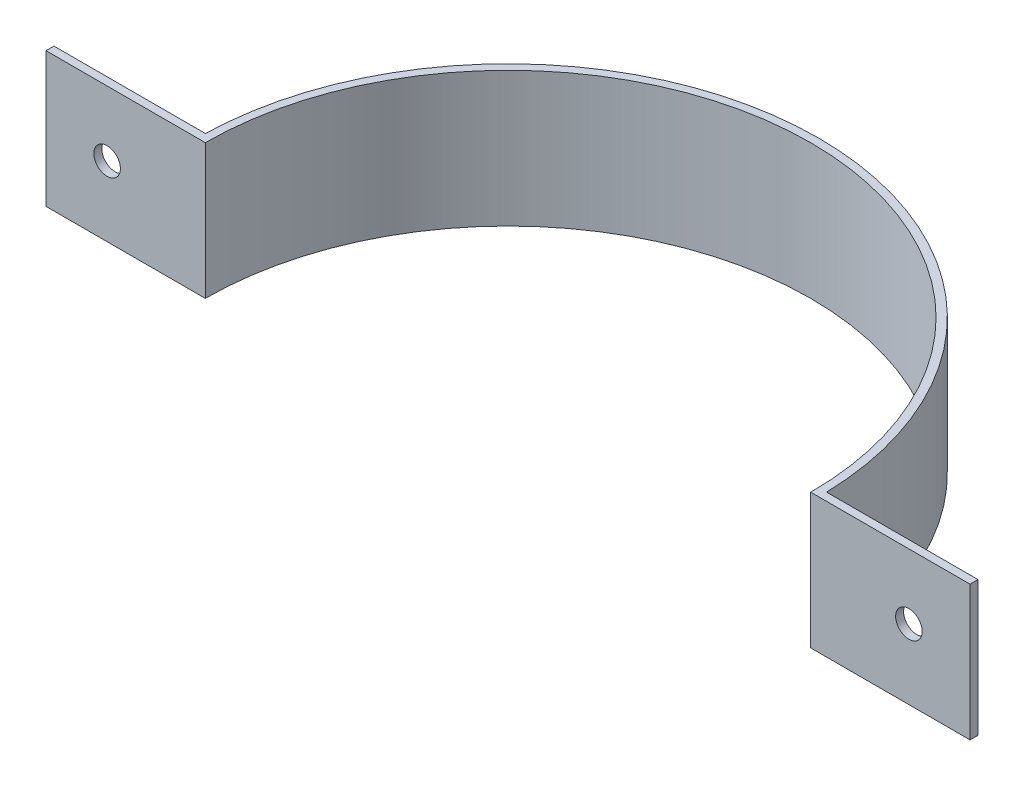
ISO-10303-21;
HEADER;
FILE_DESCRIPTION(('STEP AP214'),'2;1');
FILE_NAME('part.step','',(''),(''),'','','');
FILE_SCHEMA(('AUTOMOTIVE_DESIGN { 1 0 10303 214 1 1 1 1 }'));
ENDSEC;
DATA;
#1=APPLICATION_CONTEXT('core data for automotive mechanical design processes');
#2=APPLICATION_PROTOCOL_DEFINITION('international standard','automotive_design',2000,#1);
#3=PRODUCT_CONTEXT('',#1,'mechanical');
#4=PRODUCT('Part','Part','',(#3));
#5=PRODUCT_RELATED_PRODUCT_CATEGORY('part','',(#4));
#6=PRODUCT_DEFINITION_FORMATION('','',#4);
#7=PRODUCT_DEFINITION_CONTEXT('part definition',#1,'design');
#8=PRODUCT_DEFINITION('design','',#6,#7);
#9=PRODUCT_DEFINITION_SHAPE('','',#8);
#10=(LENGTH_UNIT() NAMED_UNIT(*) SI_UNIT(.MILLI.,.METRE.));
#11=(NAMED_UNIT(*) PLANE_ANGLE_UNIT() SI_UNIT($,.RADIAN.));
#12=(NAMED_UNIT(*) SI_UNIT($,.STERADIAN.) SOLID_ANGLE_UNIT());
#13=UNCERTAINTY_MEASURE_WITH_UNIT(LENGTH_MEASURE(1.E-05),#10,'distance_accuracy_value','');
#14=(GEOMETRIC_REPRESENTATION_CONTEXT(3) GLOBAL_UNCERTAINTY_ASSIGNED_CONTEXT((#13)) GLOBAL_UNIT_ASSIGNED_CONTEXT((#10,
#11,#12)) REPRESENTATION_CONTEXT('',''));
#15=CARTESIAN_POINT('',(0.,0.,0.));
#16=DIRECTION('',(0.,0.,1.));
#17=DIRECTION('',(1.,0.,0.));
#18=AXIS2_PLACEMENT_3D('',#15,#16,#17);
#19=CARTESIAN_POINT('',(0.,25.4,0.));
#20=DIRECTION('',(0.,-1.,0.));
#21=DIRECTION('',(0.,0.,-1.));
#22=AXIS2_PLACEMENT_3D('',#19,#20,#21);
#23=CYLINDRICAL_SURFACE('',#22,58.5);
#24=CARTESIAN_POINT('',(0.,25.4,0.));
#25=DIRECTION('',(0.,1.,0.));
#26=DIRECTION('',(0.,0.,1.));
#27=AXIS2_PLACEMENT_3D('',#24,#25,#26);
#28=CIRCLE('',#27,58.5);
#29=CARTESIAN_POINT('',(58.4807660688538,25.4,-1.5));
#30=VERTEX_POINT('',#29);
#31=CARTESIAN_POINT('',(-58.4807660688538,25.4,-1.5));
#32=VERTEX_POINT('',#31);
#33=EDGE_CURVE('E52',#30,#32,#28,.T.);
#34=ORIENTED_EDGE('',*,*,#33,.F.);
#35=DIRECTION('',(0.,-1.,0.));
#36=VECTOR('',#35,1.);
#37=CARTESIAN_POINT('',(58.4807660688538,25.4,-1.5));
#38=LINE('',#37,#36);
#39=CARTESIAN_POINT('',(58.4807660688538,0.,-1.5));
#40=VERTEX_POINT('',#39);
#41=EDGE_CURVE('E56',#30,#40,#38,.T.);
#42=ORIENTED_EDGE('',*,*,#41,.T.);
#43=CARTESIAN_POINT('',(0.,0.,0.));
#44=DIRECTION('',(0.,1.,0.));
#45=DIRECTION('',(0.,0.,1.));
#46=AXIS2_PLACEMENT_3D('',#43,#44,#45);
#47=CIRCLE('',#46,58.5);
#48=CARTESIAN_POINT('',(-58.4807660688538,0.,-1.5));
#49=VERTEX_POINT('',#48);
#50=EDGE_CURVE('E164',#40,#49,#47,.T.);
#51=ORIENTED_EDGE('',*,*,#50,.T.);
#52=DIRECTION('',(0.,-1.,0.));
#53=VECTOR('',#52,1.);
#54=CARTESIAN_POINT('',(-58.4807660688538,25.4,-1.5));
#55=LINE('',#54,#53);
#56=EDGE_CURVE('E147',#32,#49,#55,.T.);
#57=ORIENTED_EDGE('',*,*,#56,.F.);
#58=EDGE_LOOP('',(#34,#42,#51,#57));
#59=FACE_BOUND('',#58,.T.);
#60=ADVANCED_FACE('F37',(#59),#23,.T.);
#61=CARTESIAN_POINT('',(0.,25.4,0.));
#62=DIRECTION('',(0.,-1.,0.));
#63=DIRECTION('',(0.,0.,-1.));
#64=AXIS2_PLACEMENT_3D('',#61,#62,#63);
#65=CYLINDRICAL_SURFACE('',#64,57.);
#66=CARTESIAN_POINT('',(0.,0.,0.));
#67=DIRECTION('',(0.,-1.,0.));
#68=DIRECTION('',(0.,0.,1.));
#69=AXIS2_PLACEMENT_3D('',#66,#67,#68);
#70=CIRCLE('',#69,57.);
#71=CARTESIAN_POINT('',(-57.,0.,0.));
#72=VERTEX_POINT('',#71);
#73=CARTESIAN_POINT('',(57.,0.,0.));
#74=VERTEX_POINT('',#73);
#75=EDGE_CURVE('E152',#72,#74,#70,.T.);
#76=ORIENTED_EDGE('',*,*,#75,.T.);
#77=DIRECTION('',(0.,-1.,0.));
#78=VECTOR('',#77,1.);
#79=CARTESIAN_POINT('',(57.,25.4,0.));
#80=LINE('',#79,#78);
#81=CARTESIAN_POINT('',(57.,25.4,0.));
#82=VERTEX_POINT('',#81);
#83=EDGE_CURVE('E11',#82,#74,#80,.T.);
#84=ORIENTED_EDGE('',*,*,#83,.F.);
#85=CARTESIAN_POINT('',(0.,25.4,0.));
#86=DIRECTION('',(0.,-1.,0.));
#87=DIRECTION('',(0.,0.,1.));
#88=AXIS2_PLACEMENT_3D('',#85,#86,#87);
#89=CIRCLE('',#88,57.);
#90=CARTESIAN_POINT('',(-57.,25.4,0.));
#91=VERTEX_POINT('',#90);
#92=EDGE_CURVE('E153',#91,#82,#89,.T.);
#93=ORIENTED_EDGE('',*,*,#92,.F.);
#94=DIRECTION('',(0.,-1.,0.));
#95=VECTOR('',#94,1.);
#96=CARTESIAN_POINT('',(-57.,25.4,0.));
#97=LINE('',#96,#95);
#98=EDGE_CURVE('E45',#91,#72,#97,.T.);
#99=ORIENTED_EDGE('',*,*,#98,.T.);
#100=EDGE_LOOP('',(#76,#84,#93,#99));
#101=FACE_BOUND('',#100,.T.);
#102=ADVANCED_FACE('F39',(#101),#65,.F.);
#103=CARTESIAN_POINT('',(57.,25.4,0.));
#104=DIRECTION('',(0.,0.,-1.));
#105=DIRECTION('',(-1.,0.,0.));
#106=AXIS2_PLACEMENT_3D('',#103,#104,#105);
#107=PLANE('',#106);
#108=CARTESIAN_POINT('',(75.49,13.1643140445107,0.));
#109=DIRECTION('',(0.,0.,-1.));
#110=DIRECTION('',(-1.,0.,0.));
#111=AXIS2_PLACEMENT_3D('',#108,#109,#110);
#112=CIRCLE('',#111,2.5);
#113=CARTESIAN_POINT('',(72.99,13.1643140445107,0.));
#114=VERTEX_POINT('',#113);
#115=EDGE_CURVE('E202',#114,#114,#112,.T.);
#116=ORIENTED_EDGE('',*,*,#115,.T.);
#117=EDGE_LOOP('',(#116));
#118=FACE_BOUND('',#117,.T.);
#119=DIRECTION('',(1.,0.,0.));
#120=VECTOR('',#119,1.);
#121=CARTESIAN_POINT('',(57.,0.,0.));
#122=LINE('',#121,#120);
#123=CARTESIAN_POINT('',(87.,0.,0.));
#124=VERTEX_POINT('',#123);
#125=EDGE_CURVE('E162',#74,#124,#122,.T.);
#126=ORIENTED_EDGE('',*,*,#125,.T.);
#127=DIRECTION('',(0.,1.,0.));
#128=VECTOR('',#127,1.);
#129=CARTESIAN_POINT('',(87.,25.4,0.));
#130=LINE('',#129,#128);
#131=CARTESIAN_POINT('',(87.,25.4,0.));
#132=VERTEX_POINT('',#131);
#133=EDGE_CURVE('E122',#124,#132,#130,.T.);
#134=ORIENTED_EDGE('',*,*,#133,.T.);
#135=DIRECTION('',(1.,0.,0.));
#136=VECTOR('',#135,1.);
#137=CARTESIAN_POINT('',(57.,25.4,0.));
#138=LINE('',#137,#136);
#139=EDGE_CURVE('E105',#82,#132,#138,.T.);
#140=ORIENTED_EDGE('',*,*,#139,.F.);
#141=ORIENTED_EDGE('',*,*,#83,.T.);
#142=EDGE_LOOP('',(#126,#134,#140,#141));
#143=FACE_BOUND('',#142,.T.);
#144=ADVANCED_FACE('F176',(#118,#143),#107,.F.);
#145=CARTESIAN_POINT('',(-58.5,25.4,0.));
#146=DIRECTION('',(0.,0.,-1.));
#147=DIRECTION('',(-1.,0.,0.));
#148=AXIS2_PLACEMENT_3D('',#145,#146,#147);
#149=PLANE('',#148);
#150=CARTESIAN_POINT('',(-75.49,13.1643140445107,0.));
#151=DIRECTION('',(0.,0.,-1.));
#152=DIRECTION('',(-1.,0.,0.));
#153=AXIS2_PLACEMENT_3D('',#150,#151,#152);
#154=CIRCLE('',#153,2.5);
#155=CARTESIAN_POINT('',(-77.99,13.1643140445107,0.));
#156=VERTEX_POINT('',#155);
#157=EDGE_CURVE('E124',#156,#156,#154,.T.);
#158=ORIENTED_EDGE('',*,*,#157,.T.);
#159=EDGE_LOOP('',(#158));
#160=FACE_BOUND('',#159,.T.);
#161=DIRECTION('',(1.,0.,0.));
#162=VECTOR('',#161,1.);
#163=CARTESIAN_POINT('',(-58.5,0.,0.));
#164=LINE('',#163,#162);
#165=CARTESIAN_POINT('',(-87.,0.,0.));
#166=VERTEX_POINT('',#165);
#167=EDGE_CURVE('E155',#166,#72,#164,.T.);
#168=ORIENTED_EDGE('',*,*,#167,.T.);
#169=ORIENTED_EDGE('',*,*,#98,.F.);
#170=DIRECTION('',(1.,0.,0.));
#171=VECTOR('',#170,1.);
#172=CARTESIAN_POINT('',(-58.5,25.4,0.));
#173=LINE('',#172,#171);
#174=CARTESIAN_POINT('',(-87.,25.4,0.));
#175=VERTEX_POINT('',#174);
#176=EDGE_CURVE('E158',#175,#91,#173,.T.);
#177=ORIENTED_EDGE('',*,*,#176,.F.);
#178=DIRECTION('',(0.,-1.,0.));
#179=VECTOR('',#178,1.);
#180=CARTESIAN_POINT('',(-87.,0.,0.));
#181=LINE('',#180,#179);
#182=EDGE_CURVE('E132',#175,#166,#181,.T.);
#183=ORIENTED_EDGE('',*,*,#182,.T.);
#184=EDGE_LOOP('',(#168,#169,#177,#183));
#185=FACE_BOUND('',#184,.T.);
#186=ADVANCED_FACE('F179',(#160,#185),#149,.F.);
#187=CARTESIAN_POINT('',(0.,25.4,0.));
#188=DIRECTION('',(0.,1.,0.));
#189=DIRECTION('',(0.,0.,1.));
#190=AXIS2_PLACEMENT_3D('',#187,#188,#189);
#191=PLANE('',#190);
#192=ORIENTED_EDGE('',*,*,#92,.T.);
#193=ORIENTED_EDGE('',*,*,#139,.T.);
#194=DIRECTION('',(0.,0.,1.));
#195=VECTOR('',#194,1.);
#196=CARTESIAN_POINT('',(87.,25.4,-1.5));
#197=LINE('',#196,#195);
#198=CARTESIAN_POINT('',(87.,25.4,-1.5));
#199=VERTEX_POINT('',#198);
#200=EDGE_CURVE('E100',#199,#132,#197,.T.);
#201=ORIENTED_EDGE('',*,*,#200,.F.);
#202=DIRECTION('',(-1.,0.,0.));
#203=VECTOR('',#202,1.);
#204=CARTESIAN_POINT('',(57.,25.4,-1.5));
#205=LINE('',#204,#203);
#206=EDGE_CURVE('E104',#199,#30,#205,.T.);
#207=ORIENTED_EDGE('',*,*,#206,.T.);
#208=ORIENTED_EDGE('',*,*,#33,.T.);
#209=DIRECTION('',(-1.,0.,0.));
#210=VECTOR('',#209,1.);
#211=CARTESIAN_POINT('',(-57.,25.4,-1.5));
#212=LINE('',#211,#210);
#213=CARTESIAN_POINT('',(-87.,25.4,-1.5));
#214=VERTEX_POINT('',#213);
#215=EDGE_CURVE('E133',#32,#214,#212,.T.);
#216=ORIENTED_EDGE('',*,*,#215,.T.);
#217=DIRECTION('',(0.,0.,1.));
#218=VECTOR('',#217,1.);
#219=CARTESIAN_POINT('',(-87.,25.4,-1.5));
#220=LINE('',#219,#218);
#221=EDGE_CURVE('E141',#214,#175,#220,.T.);
#222=ORIENTED_EDGE('',*,*,#221,.T.);
#223=ORIENTED_EDGE('',*,*,#176,.T.);
#224=EDGE_LOOP('',(#192,#193,#201,#207,#208,#216,#222,#223));
#225=FACE_BOUND('',#224,.T.);
#226=ADVANCED_FACE('F103',(#225),#191,.T.);
#227=CARTESIAN_POINT('',(0.,0.,0.));
#228=DIRECTION('',(0.,1.,0.));
#229=DIRECTION('',(0.,0.,1.));
#230=AXIS2_PLACEMENT_3D('',#227,#228,#229);
#231=PLANE('',#230);
#232=ORIENTED_EDGE('',*,*,#125,.F.);
#233=ORIENTED_EDGE('',*,*,#75,.F.);
#234=ORIENTED_EDGE('',*,*,#167,.F.);
#235=DIRECTION('',(0.,0.,1.));
#236=VECTOR('',#235,1.);
#237=CARTESIAN_POINT('',(-87.,0.,-1.5));
#238=LINE('',#237,#236);
#239=CARTESIAN_POINT('',(-87.,0.,-1.5));
#240=VERTEX_POINT('',#239);
#241=EDGE_CURVE('E144',#240,#166,#238,.T.);
#242=ORIENTED_EDGE('',*,*,#241,.F.);
#243=DIRECTION('',(1.,0.,0.));
#244=VECTOR('',#243,1.);
#245=CARTESIAN_POINT('',(-57.,0.,-1.5));
#246=LINE('',#245,#244);
#247=EDGE_CURVE('E138',#240,#49,#246,.T.);
#248=ORIENTED_EDGE('',*,*,#247,.T.);
#249=ORIENTED_EDGE('',*,*,#50,.F.);
#250=DIRECTION('',(1.,0.,0.));
#251=VECTOR('',#250,1.);
#252=CARTESIAN_POINT('',(87.,0.,-1.5));
#253=LINE('',#252,#251);
#254=CARTESIAN_POINT('',(87.,0.,-1.5));
#255=VERTEX_POINT('',#254);
#256=EDGE_CURVE('E111',#40,#255,#253,.T.);
#257=ORIENTED_EDGE('',*,*,#256,.T.);
#258=DIRECTION('',(0.,0.,1.));
#259=VECTOR('',#258,1.);
#260=CARTESIAN_POINT('',(87.,0.,-1.5));
#261=LINE('',#260,#259);
#262=EDGE_CURVE('E110',#255,#124,#261,.T.);
#263=ORIENTED_EDGE('',*,*,#262,.T.);
#264=EDGE_LOOP('',(#232,#233,#234,#242,#248,#249,#257,#263));
#265=FACE_BOUND('',#264,.T.);
#266=ADVANCED_FACE('F174',(#265),#231,.F.);
#267=CARTESIAN_POINT('',(0.,0.,-1.5));
#268=DIRECTION('',(0.,0.,1.));
#269=DIRECTION('',(1.,0.,0.));
#270=AXIS2_PLACEMENT_3D('',#267,#268,#269);
#271=PLANE('',#270);
#272=CARTESIAN_POINT('',(-75.49,13.1643140445107,-1.5));
#273=DIRECTION('',(0.,0.,-1.));
#274=DIRECTION('',(-1.,0.,0.));
#275=AXIS2_PLACEMENT_3D('',#272,#273,#274);
#276=CIRCLE('',#275,2.5);
#277=CARTESIAN_POINT('',(-77.99,13.1643140445107,-1.5));
#278=VERTEX_POINT('',#277);
#279=EDGE_CURVE('E204',#278,#278,#276,.T.);
#280=ORIENTED_EDGE('',*,*,#279,.F.);
#281=EDGE_LOOP('',(#280));
#282=FACE_BOUND('',#281,.T.);
#283=ORIENTED_EDGE('',*,*,#215,.F.);
#284=ORIENTED_EDGE('',*,*,#56,.T.);
#285=ORIENTED_EDGE('',*,*,#247,.F.);
#286=DIRECTION('',(0.,-1.,0.));
#287=VECTOR('',#286,1.);
#288=CARTESIAN_POINT('',(-87.,0.,-1.5));
#289=LINE('',#288,#287);
#290=EDGE_CURVE('E135',#214,#240,#289,.T.);
#291=ORIENTED_EDGE('',*,*,#290,.F.);
#292=EDGE_LOOP('',(#283,#284,#285,#291));
#293=FACE_BOUND('',#292,.T.);
#294=ADVANCED_FACE('F186',(#282,#293),#271,.F.);
#295=CARTESIAN_POINT('',(-87.,0.,-1.5));
#296=DIRECTION('',(-1.,0.,0.));
#297=DIRECTION('',(0.,0.,1.));
#298=AXIS2_PLACEMENT_3D('',#295,#296,#297);
#299=PLANE('',#298);
#300=ORIENTED_EDGE('',*,*,#182,.F.);
#301=ORIENTED_EDGE('',*,*,#221,.F.);
#302=ORIENTED_EDGE('',*,*,#290,.T.);
#303=ORIENTED_EDGE('',*,*,#241,.T.);
#304=EDGE_LOOP('',(#300,#301,#302,#303));
#305=FACE_BOUND('',#304,.T.);
#306=ADVANCED_FACE('F181',(#305),#299,.T.);
#307=CARTESIAN_POINT('',(0.,0.,-1.5));
#308=DIRECTION('',(0.,0.,-1.));
#309=DIRECTION('',(-1.,0.,0.));
#310=AXIS2_PLACEMENT_3D('',#307,#308,#309);
#311=PLANE('',#310);
#312=CARTESIAN_POINT('',(75.49,13.1643140445107,-1.5));
#313=DIRECTION('',(0.,0.,-1.));
#314=DIRECTION('',(-1.,0.,0.));
#315=AXIS2_PLACEMENT_3D('',#312,#313,#314);
#316=CIRCLE('',#315,2.5);
#317=CARTESIAN_POINT('',(72.99,13.1643140445107,-1.5));
#318=VERTEX_POINT('',#317);
#319=EDGE_CURVE('E207',#318,#318,#316,.T.);
#320=ORIENTED_EDGE('',*,*,#319,.F.);
#321=EDGE_LOOP('',(#320));
#322=FACE_BOUND('',#321,.T.);
#323=ORIENTED_EDGE('',*,*,#41,.F.);
#324=ORIENTED_EDGE('',*,*,#206,.F.);
#325=DIRECTION('',(0.,1.,0.));
#326=VECTOR('',#325,1.);
#327=CARTESIAN_POINT('',(87.,25.4,-1.5));
#328=LINE('',#327,#326);
#329=EDGE_CURVE('E117',#255,#199,#328,.T.);
#330=ORIENTED_EDGE('',*,*,#329,.F.);
#331=ORIENTED_EDGE('',*,*,#256,.F.);
#332=EDGE_LOOP('',(#323,#324,#330,#331));
#333=FACE_BOUND('',#332,.T.);
#334=ADVANCED_FACE('F115',(#322,#333),#311,.T.);
#335=CARTESIAN_POINT('',(87.,25.4,-1.5));
#336=DIRECTION('',(1.,0.,0.));
#337=DIRECTION('',(0.,0.,-1.));
#338=AXIS2_PLACEMENT_3D('',#335,#336,#337);
#339=PLANE('',#338);
#340=ORIENTED_EDGE('',*,*,#133,.F.);
#341=ORIENTED_EDGE('',*,*,#262,.F.);
#342=ORIENTED_EDGE('',*,*,#329,.T.);
#343=ORIENTED_EDGE('',*,*,#200,.T.);
#344=EDGE_LOOP('',(#340,#341,#342,#343));
#345=FACE_BOUND('',#344,.T.);
#346=ADVANCED_FACE('F120',(#345),#339,.T.);
#347=CARTESIAN_POINT('',(75.49,13.1643140445107,8.5));
#348=DIRECTION('',(0.,0.,-1.));
#349=DIRECTION('',(-1.,0.,0.));
#350=AXIS2_PLACEMENT_3D('',#347,#348,#349);
#351=CYLINDRICAL_SURFACE('',#350,2.5);
#352=ORIENTED_EDGE('',*,*,#319,.T.);
#353=EDGE_LOOP('',(#352));
#354=FACE_BOUND('',#353,.T.);
#355=ORIENTED_EDGE('',*,*,#115,.F.);
#356=EDGE_LOOP('',(#355));
#357=FACE_BOUND('',#356,.T.);
#358=ADVANCED_FACE('F213',(#354,#357),#351,.F.);
#359=CARTESIAN_POINT('',(-75.49,13.1643140445107,8.5));
#360=DIRECTION('',(0.,0.,-1.));
#361=DIRECTION('',(-1.,0.,0.));
#362=AXIS2_PLACEMENT_3D('',#359,#360,#361);
#363=CYLINDRICAL_SURFACE('',#362,2.5);
#364=ORIENTED_EDGE('',*,*,#279,.T.);
#365=EDGE_LOOP('',(#364));
#366=FACE_BOUND('',#365,.T.);
#367=ORIENTED_EDGE('',*,*,#157,.F.);
#368=EDGE_LOOP('',(#367));
#369=FACE_BOUND('',#368,.T.);
#370=ADVANCED_FACE('F311',(#366,#369),#363,.F.);
#371=CLOSED_SHELL('',(#60,#102,#144,#186,#226,#266,#294,#306,#334,#346,#358,#370));
#372=MANIFOLD_SOLID_BREP('B2',#371);
#373=ADVANCED_BREP_SHAPE_REPRESENTATION('',(#18,#372),#14);
#374=SHAPE_DEFINITION_REPRESENTATION(#9,#373);
ENDSEC;
END-ISO-10303-21;
